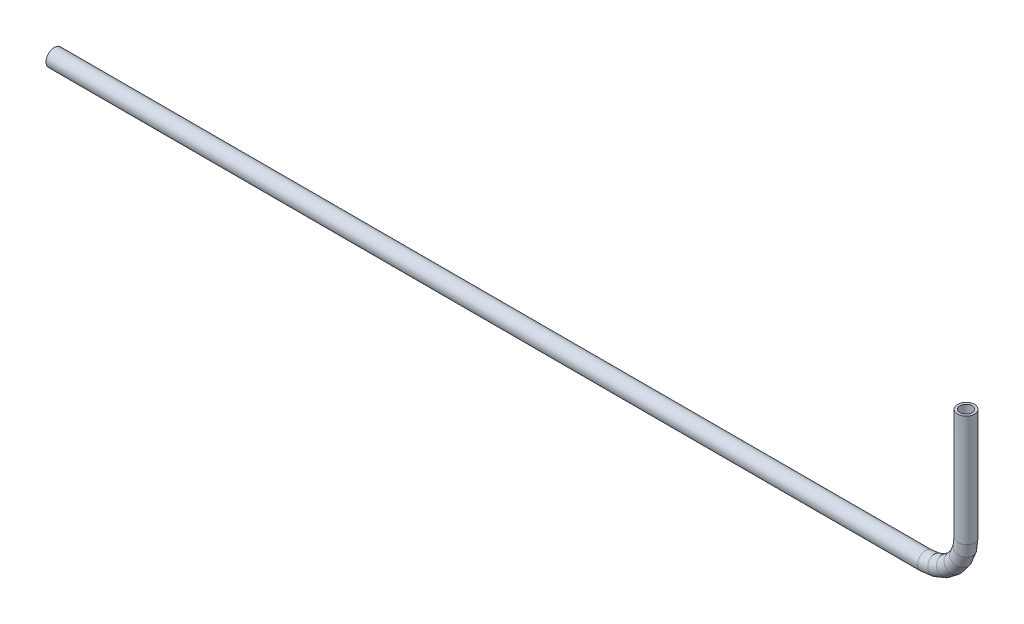
ISO-10303-21;
HEADER;
FILE_DESCRIPTION(('STEP AP214'),'2;1');
FILE_NAME('part.step','',(''),(''),'','','');
FILE_SCHEMA(('AUTOMOTIVE_DESIGN { 1 0 10303 214 1 1 1 1 }'));
ENDSEC;
DATA;
#1=APPLICATION_CONTEXT('core data for automotive mechanical design processes');
#2=APPLICATION_PROTOCOL_DEFINITION('international standard','automotive_design',2000,#1);
#3=PRODUCT_CONTEXT('',#1,'mechanical');
#4=PRODUCT('Part','Part','',(#3));
#5=PRODUCT_RELATED_PRODUCT_CATEGORY('part','',(#4));
#6=PRODUCT_DEFINITION_FORMATION('','',#4);
#7=PRODUCT_DEFINITION_CONTEXT('part definition',#1,'design');
#8=PRODUCT_DEFINITION('design','',#6,#7);
#9=PRODUCT_DEFINITION_SHAPE('','',#8);
#10=(LENGTH_UNIT() NAMED_UNIT(*) SI_UNIT(.MILLI.,.METRE.));
#11=(NAMED_UNIT(*) PLANE_ANGLE_UNIT() SI_UNIT($,.RADIAN.));
#12=(NAMED_UNIT(*) SI_UNIT($,.STERADIAN.) SOLID_ANGLE_UNIT());
#13=UNCERTAINTY_MEASURE_WITH_UNIT(LENGTH_MEASURE(1.E-05),#10,'distance_accuracy_value','');
#14=(GEOMETRIC_REPRESENTATION_CONTEXT(3) GLOBAL_UNCERTAINTY_ASSIGNED_CONTEXT((#13)) GLOBAL_UNIT_ASSIGNED_CONTEXT((#10,
#11,#12)) REPRESENTATION_CONTEXT('',''));
#15=CARTESIAN_POINT('',(0.,0.,0.));
#16=DIRECTION('',(0.,0.,1.));
#17=DIRECTION('',(1.,0.,0.));
#18=AXIS2_PLACEMENT_3D('',#15,#16,#17);
#19=CARTESIAN_POINT('',(-3008.59277838078,-73.557821087765,0.));
#20=DIRECTION('',(0.,1.,0.));
#21=DIRECTION('',(0.,0.,1.));
#22=AXIS2_PLACEMENT_3D('',#19,#20,#21);
#23=CYLINDRICAL_SURFACE('',#22,3.175);
#24=CARTESIAN_POINT('',(-3008.59277838078,-73.,0.));
#25=DIRECTION('',(0.0654031292301811,0.997858923238601,0.));
#26=DIRECTION('',(0.997858923238601,-0.0654031292301811,0.));
#27=AXIS2_PLACEMENT_3D('',#24,#25,#26);
#28=ELLIPSE('',#27,3.18181250481318,3.175);
#29=CARTESIAN_POINT('',(-3005.41777838077,-73.2081004944385,0.));
#30=VERTEX_POINT('',#29);
#31=EDGE_CURVE('E45',#30,#30,#28,.F.);
#32=ORIENTED_EDGE('',*,*,#31,.F.);
#33=EDGE_LOOP('',(#32));
#34=FACE_BOUND('',#33,.T.);
#35=CARTESIAN_POINT('',(-3008.59277838078,-31.2999999999977,0.));
#36=DIRECTION('',(0.,1.,0.));
#37=DIRECTION('',(0.,0.,-1.));
#38=AXIS2_PLACEMENT_3D('',#35,#36,#37);
#39=CIRCLE('',#38,3.175);
#40=CARTESIAN_POINT('',(-3008.59277838078,-31.2999999999977,-3.175));
#41=VERTEX_POINT('',#40);
#42=EDGE_CURVE('E80',#41,#41,#39,.T.);
#43=ORIENTED_EDGE('',*,*,#42,.F.);
#44=EDGE_LOOP('',(#43));
#45=FACE_BOUND('',#44,.T.);
#46=ADVANCED_FACE('F39',(#34,#45),#23,.T.);
#47=CARTESIAN_POINT('',(-3009.23697453862,-77.8931556153313,0.));
#48=DIRECTION('',(0.130526192220127,0.991444861373801,0.));
#49=DIRECTION('',(-0.991444861373801,0.130526192220127,0.));
#50=AXIS2_PLACEMENT_3D('',#47,#48,#49);
#51=CYLINDRICAL_SURFACE('',#50,3.175);
#52=CARTESIAN_POINT('',(-3009.10389098644,-76.8822856765375,0.));
#53=DIRECTION('',(0.258819045102505,0.965925826289073,0.));
#54=DIRECTION('',(0.965925826289073,-0.258819045102505,0.));
#55=AXIS2_PLACEMENT_3D('',#52,#53,#54);
#56=ELLIPSE('',#55,3.20239694984195,3.175);
#57=CARTESIAN_POINT('',(-3006.01061306656,-77.7111269971348,0.));
#58=VERTEX_POINT('',#57);
#59=EDGE_CURVE('E94',#58,#58,#56,.F.);
#60=ORIENTED_EDGE('',*,*,#59,.F.);
#61=EDGE_LOOP('',(#60));
#62=FACE_BOUND('',#61,.T.);
#63=ORIENTED_EDGE('',*,*,#31,.T.);
#64=EDGE_LOOP('',(#63));
#65=FACE_BOUND('',#64,.T.);
#66=ADVANCED_FACE('F101',(#62,#65),#51,.T.);
#67=CARTESIAN_POINT('',(-3010.99257855639,-81.4419808230071,0.));
#68=DIRECTION('',(0.382683432364989,0.923879532511329,0.));
#69=DIRECTION('',(-0.923879532511329,0.382683432364989,0.));
#70=AXIS2_PLACEMENT_3D('',#67,#68,#69);
#71=CYLINDRICAL_SURFACE('',#70,3.175);
#72=CARTESIAN_POINT('',(-3010.60239732401,-80.4999999999997,0.));
#73=DIRECTION('',(0.499999999999964,0.866025403784459,0.));
#74=DIRECTION('',(0.866025403784459,-0.499999999999964,0.));
#75=AXIS2_PLACEMENT_3D('',#72,#73,#74);
#76=ELLIPSE('',#75,3.20239694984201,3.175);
#77=CARTESIAN_POINT('',(-3007.82904021244,-82.1011984749206,0.));
#78=VERTEX_POINT('',#77);
#79=EDGE_CURVE('E95',#78,#78,#76,.F.);
#80=ORIENTED_EDGE('',*,*,#79,.F.);
#81=EDGE_LOOP('',(#80));
#82=FACE_BOUND('',#81,.T.);
#83=ORIENTED_EDGE('',*,*,#59,.T.);
#84=EDGE_LOOP('',(#83));
#85=FACE_BOUND('',#84,.T.);
#86=ADVANCED_FACE('F251',(#82,#85),#71,.T.);
#87=CARTESIAN_POINT('',(-3013.60686536939,-84.4154989886263,0.));
#88=DIRECTION('',(0.608761429008741,0.793353340291219,0.));
#89=DIRECTION('',(-0.793353340291219,0.608761429008742,0.));
#90=AXIS2_PLACEMENT_3D('',#87,#88,#89);
#91=CYLINDRICAL_SURFACE('',#90,3.175);
#92=CARTESIAN_POINT('',(-3012.98617666298,-83.6066017177978,0.));
#93=DIRECTION('',(0.70710678118655,0.707106781186545,0.));
#94=DIRECTION('',(0.707106781186545,-0.70710678118655,0.));
#95=AXIS2_PLACEMENT_3D('',#92,#93,#94);
#96=ELLIPSE('',#95,3.20239694984198,3.175);
#97=CARTESIAN_POINT('',(-3010.72174006369,-85.8710383170821,0.));
#98=VERTEX_POINT('',#97);
#99=EDGE_CURVE('E90',#98,#98,#96,.F.);
#100=ORIENTED_EDGE('',*,*,#99,.F.);
#101=EDGE_LOOP('',(#100));
#102=FACE_BOUND('',#101,.T.);
#103=ORIENTED_EDGE('',*,*,#79,.T.);
#104=EDGE_LOOP('',(#103));
#105=FACE_BOUND('',#104,.T.);
#106=ADVANCED_FACE('F241',(#102,#105),#91,.T.);
#107=CARTESIAN_POINT('',(-3016.9016756516,-86.6110697631757,0.));
#108=DIRECTION('',(0.793353340291223,0.608761429008737,0.));
#109=DIRECTION('',(-0.608761429008737,0.793353340291223,0.));
#110=AXIS2_PLACEMENT_3D('',#107,#108,#109);
#111=CYLINDRICAL_SURFACE('',#110,3.175);
#112=CARTESIAN_POINT('',(-3016.09277838077,-85.9903810567666,0.));
#113=DIRECTION('',(0.866025403784438,0.500000000000001,0.));
#114=DIRECTION('',(0.500000000000001,-0.866025403784438,0.));
#115=AXIS2_PLACEMENT_3D('',#112,#113,#114);
#116=ELLIPSE('',#115,3.20239694984199,3.175);
#117=CARTESIAN_POINT('',(-3014.49157990585,-88.7637381683316,0.));
#118=VERTEX_POINT('',#117);
#119=EDGE_CURVE('E88',#118,#118,#116,.F.);
#120=ORIENTED_EDGE('',*,*,#119,.F.);
#121=EDGE_LOOP('',(#120));
#122=FACE_BOUND('',#121,.T.);
#123=ORIENTED_EDGE('',*,*,#99,.T.);
#124=EDGE_LOOP('',(#123));
#125=FACE_BOUND('',#124,.T.);
#126=ADVANCED_FACE('F234',(#122,#125),#111,.T.);
#127=CARTESIAN_POINT('',(-3020.65247352724,-87.879068626721,0.));
#128=DIRECTION('',(0.923879532511294,0.382683432365073,0.));
#129=DIRECTION('',(-0.382683432365073,0.923879532511294,0.));
#130=AXIS2_PLACEMENT_3D('',#127,#128,#129);
#131=CYLINDRICAL_SURFACE('',#130,3.175);
#132=CARTESIAN_POINT('',(-3019.71049270424,-87.4888873943361,0.));
#133=DIRECTION('',(0.965925826289071,0.25881904510251,0.));
#134=DIRECTION('',(0.25881904510251,-0.965925826289071,0.));
#135=AXIS2_PLACEMENT_3D('',#132,#133,#134);
#136=ELLIPSE('',#135,3.20239694984198,3.175);
#137=CARTESIAN_POINT('',(-3018.88165138364,-90.5821653142178,0.));
#138=VERTEX_POINT('',#137);
#139=EDGE_CURVE('E82',#138,#138,#136,.F.);
#140=ORIENTED_EDGE('',*,*,#139,.F.);
#141=EDGE_LOOP('',(#140));
#142=FACE_BOUND('',#141,.T.);
#143=ORIENTED_EDGE('',*,*,#119,.T.);
#144=EDGE_LOOP('',(#143));
#145=FACE_BOUND('',#144,.T.);
#146=ADVANCED_FACE('F227',(#142,#145),#131,.T.);
#147=CARTESIAN_POINT('',(-3024.1458272318,-88.072810262526,0.));
#148=DIRECTION('',(0.991444861373811,0.130526192220047,0.));
#149=DIRECTION('',(-0.130526192220047,0.991444861373811,0.));
#150=AXIS2_PLACEMENT_3D('',#147,#148,#149);
#151=CYLINDRICAL_SURFACE('',#150,3.175);
#152=CARTESIAN_POINT('',(-3023.59277838077,-88.,0.));
#153=DIRECTION('',(0.997858923238604,0.0654031292301407,0.));
#154=DIRECTION('',(0.0654031292301407,-0.997858923238604,0.));
#155=AXIS2_PLACEMENT_3D('',#152,#153,#154);
#156=ELLIPSE('',#155,3.18181250481318,3.175);
#157=CARTESIAN_POINT('',(-3023.38467788634,-91.175,0.));
#158=VERTEX_POINT('',#157);
#159=EDGE_CURVE('E78',#158,#158,#156,.F.);
#160=ORIENTED_EDGE('',*,*,#159,.F.);
#161=EDGE_LOOP('',(#160));
#162=FACE_BOUND('',#161,.T.);
#163=ORIENTED_EDGE('',*,*,#139,.T.);
#164=EDGE_LOOP('',(#163));
#165=FACE_BOUND('',#164,.T.);
#166=ADVANCED_FACE('F118',(#162,#165),#151,.T.);
#167=CARTESIAN_POINT('',(-3351.14277838077,-88.,0.));
#168=DIRECTION('',(1.,0.,0.));
#169=DIRECTION('',(0.,0.,-1.));
#170=AXIS2_PLACEMENT_3D('',#167,#168,#169);
#171=CYLINDRICAL_SURFACE('',#170,3.175);
#172=CARTESIAN_POINT('',(-3351.14277838077,-88.,0.));
#173=DIRECTION('',(1.,0.,0.));
#174=DIRECTION('',(0.,0.,-1.));
#175=AXIS2_PLACEMENT_3D('',#172,#173,#174);
#176=CIRCLE('',#175,3.175);
#177=CARTESIAN_POINT('',(-3351.14277838077,-88.,-3.17499999999999));
#178=VERTEX_POINT('',#177);
#179=EDGE_CURVE('E74',#178,#178,#176,.T.);
#180=ORIENTED_EDGE('',*,*,#179,.T.);
#181=EDGE_LOOP('',(#180));
#182=FACE_BOUND('',#181,.T.);
#183=ORIENTED_EDGE('',*,*,#159,.T.);
#184=EDGE_LOOP('',(#183));
#185=FACE_BOUND('',#184,.T.);
#186=ADVANCED_FACE('F109',(#182,#185),#171,.T.);
#187=CARTESIAN_POINT('',(-3008.59277838078,-31.2999999999977,0.));
#188=DIRECTION('',(0.,1.,0.));
#189=DIRECTION('',(0.,0.,-1.));
#190=AXIS2_PLACEMENT_3D('',#187,#188,#189);
#191=PLANE('',#190);
#192=CARTESIAN_POINT('',(-3008.59277838078,-31.2999999999977,0.));
#193=DIRECTION('',(0.,1.,0.));
#194=DIRECTION('',(0.,0.,-1.));
#195=AXIS2_PLACEMENT_3D('',#192,#193,#194);
#196=CIRCLE('',#195,2.286);
#197=CARTESIAN_POINT('',(-3008.59277838078,-31.2999999999977,-2.286));
#198=VERTEX_POINT('',#197);
#199=EDGE_CURVE('E72',#198,#198,#196,.F.);
#200=ORIENTED_EDGE('',*,*,#199,.T.);
#201=EDGE_LOOP('',(#200));
#202=FACE_BOUND('',#201,.T.);
#203=ORIENTED_EDGE('',*,*,#42,.T.);
#204=EDGE_LOOP('',(#203));
#205=FACE_BOUND('',#204,.T.);
#206=ADVANCED_FACE('F110',(#202,#205),#191,.T.);
#207=CARTESIAN_POINT('',(-3351.14277838077,-88.,0.));
#208=DIRECTION('',(1.,0.,0.));
#209=DIRECTION('',(0.,0.,-1.));
#210=AXIS2_PLACEMENT_3D('',#207,#208,#209);
#211=PLANE('',#210);
#212=CARTESIAN_POINT('',(-3351.14277838077,-88.,0.));
#213=DIRECTION('',(1.,0.,0.));
#214=DIRECTION('',(0.,0.,-1.));
#215=AXIS2_PLACEMENT_3D('',#212,#213,#214);
#216=CIRCLE('',#215,2.286);
#217=CARTESIAN_POINT('',(-3351.14277838077,-88.,-2.28599999999999));
#218=VERTEX_POINT('',#217);
#219=EDGE_CURVE('E46',#218,#218,#216,.F.);
#220=ORIENTED_EDGE('',*,*,#219,.F.);
#221=EDGE_LOOP('',(#220));
#222=FACE_BOUND('',#221,.T.);
#223=ORIENTED_EDGE('',*,*,#179,.F.);
#224=EDGE_LOOP('',(#223));
#225=FACE_BOUND('',#224,.T.);
#226=ADVANCED_FACE('F108',(#222,#225),#211,.F.);
#227=CARTESIAN_POINT('',(-3008.59277838078,-73.4296311831906,0.));
#228=DIRECTION('',(0.,1.,0.));
#229=DIRECTION('',(0.,0.,1.));
#230=AXIS2_PLACEMENT_3D('',#227,#228,#229);
#231=CYLINDRICAL_SURFACE('',#230,2.286);
#232=CARTESIAN_POINT('',(-3008.59277838078,-73.,0.));
#233=DIRECTION('',(0.0654031292301811,0.997858923238601,0.));
#234=DIRECTION('',(0.997858923238601,-0.0654031292301811,0.));
#235=AXIS2_PLACEMENT_3D('',#232,#233,#234);
#236=ELLIPSE('',#235,2.29090500346549,2.286);
#237=CARTESIAN_POINT('',(-3006.30677838078,-73.1498323559957,0.));
#238=VERTEX_POINT('',#237);
#239=EDGE_CURVE('E67',#238,#238,#236,.T.);
#240=ORIENTED_EDGE('',*,*,#239,.F.);
#241=EDGE_LOOP('',(#240));
#242=FACE_BOUND('',#241,.T.);
#243=ORIENTED_EDGE('',*,*,#199,.F.);
#244=EDGE_LOOP('',(#243));
#245=FACE_BOUND('',#244,.T.);
#246=ADVANCED_FACE('F120',(#242,#245),#231,.F.);
#247=CARTESIAN_POINT('',(-3009.20336587739,-77.6378724885882,0.));
#248=DIRECTION('',(0.130526192220127,0.991444861373801,0.));
#249=DIRECTION('',(-0.991444861373801,0.130526192220127,0.));
#250=AXIS2_PLACEMENT_3D('',#247,#248,#249);
#251=CYLINDRICAL_SURFACE('',#250,2.286);
#252=CARTESIAN_POINT('',(-3009.10389098644,-76.8822856765376,0.));
#253=DIRECTION('',(0.258819045102505,0.965925826289073,0.));
#254=DIRECTION('',(0.965925826289073,-0.258819045102505,0.));
#255=AXIS2_PLACEMENT_3D('',#252,#253,#254);
#256=ELLIPSE('',#255,2.3057258038862,2.286);
#257=CARTESIAN_POINT('',(-3006.87673088412,-77.4790514273676,0.));
#258=VERTEX_POINT('',#257);
#259=EDGE_CURVE('E63',#258,#258,#256,.T.);
#260=ORIENTED_EDGE('',*,*,#259,.F.);
#261=EDGE_LOOP('',(#260));
#262=FACE_BOUND('',#261,.T.);
#263=ORIENTED_EDGE('',*,*,#239,.T.);
#264=EDGE_LOOP('',(#263));
#265=FACE_BOUND('',#264,.T.);
#266=ADVANCED_FACE('F149',(#262,#265),#251,.F.);
#267=CARTESIAN_POINT('',(-3010.89404294743,-81.2040948194754,0.));
#268=DIRECTION('',(0.382683432364989,0.923879532511329,0.));
#269=DIRECTION('',(-0.923879532511329,0.382683432364989,0.));
#270=AXIS2_PLACEMENT_3D('',#267,#268,#269);
#271=CYLINDRICAL_SURFACE('',#270,2.286);
#272=CARTESIAN_POINT('',(-3010.60239732401,-80.4999999999998,0.));
#273=DIRECTION('',(0.499999999999964,0.866025403784459,0.));
#274=DIRECTION('',(0.86602540378446,-0.499999999999964,0.));
#275=AXIS2_PLACEMENT_3D('',#272,#273,#274);
#276=ELLIPSE('',#275,2.30572580388625,2.286);
#277=CARTESIAN_POINT('',(-3008.60558020368,-81.6528629019429,0.));
#278=VERTEX_POINT('',#277);
#279=EDGE_CURVE('E65',#278,#278,#276,.T.);
#280=ORIENTED_EDGE('',*,*,#279,.F.);
#281=EDGE_LOOP('',(#280));
#282=FACE_BOUND('',#281,.T.);
#283=ORIENTED_EDGE('',*,*,#259,.T.);
#284=EDGE_LOOP('',(#283));
#285=FACE_BOUND('',#284,.T.);
#286=ADVANCED_FACE('F144',(#282,#285),#271,.F.);
#287=CARTESIAN_POINT('',(-3013.4501178516,-84.2112216463229,0.));
#288=DIRECTION('',(0.608761429008742,0.793353340291219,0.));
#289=DIRECTION('',(-0.793353340291219,0.608761429008742,0.));
#290=AXIS2_PLACEMENT_3D('',#287,#288,#289);
#291=CYLINDRICAL_SURFACE('',#290,2.286);
#292=CARTESIAN_POINT('',(-3012.98617666298,-83.6066017177978,0.));
#293=DIRECTION('',(0.70710678118655,0.707106781186546,0.));
#294=DIRECTION('',(0.707106781186546,-0.70710678118655,0.));
#295=AXIS2_PLACEMENT_3D('',#292,#293,#294);
#296=ELLIPSE('',#295,2.30572580388622,2.286);
#297=CARTESIAN_POINT('',(-3011.35578231149,-85.2369960692825,0.));
#298=VERTEX_POINT('',#297);
#299=EDGE_CURVE('E56',#298,#298,#296,.T.);
#300=ORIENTED_EDGE('',*,*,#299,.F.);
#301=EDGE_LOOP('',(#300));
#302=FACE_BOUND('',#301,.T.);
#303=ORIENTED_EDGE('',*,*,#279,.T.);
#304=EDGE_LOOP('',(#303));
#305=FACE_BOUND('',#304,.T.);
#306=ADVANCED_FACE('F143',(#302,#305),#291,.F.);
#307=CARTESIAN_POINT('',(-3016.6973983093,-86.4543222453933,0.));
#308=DIRECTION('',(0.793353340291223,0.608761429008737,0.));
#309=DIRECTION('',(-0.608761429008737,0.793353340291223,0.));
#310=AXIS2_PLACEMENT_3D('',#307,#308,#309);
#311=CYLINDRICAL_SURFACE('',#310,2.286);
#312=CARTESIAN_POINT('',(-3016.09277838077,-85.9903810567666,0.));
#313=DIRECTION('',(0.866025403784438,0.500000000000001,0.));
#314=DIRECTION('',(0.500000000000001,-0.866025403784438,0.));
#315=AXIS2_PLACEMENT_3D('',#312,#313,#314);
#316=ELLIPSE('',#315,2.30572580388623,2.286);
#317=CARTESIAN_POINT('',(-3014.93991547883,-87.9871981770934,0.));
#318=VERTEX_POINT('',#317);
#319=EDGE_CURVE('E57',#318,#318,#316,.T.);
#320=ORIENTED_EDGE('',*,*,#319,.F.);
#321=EDGE_LOOP('',(#320));
#322=FACE_BOUND('',#321,.T.);
#323=ORIENTED_EDGE('',*,*,#299,.T.);
#324=EDGE_LOOP('',(#323));
#325=FACE_BOUND('',#324,.T.);
#326=ADVANCED_FACE('F140',(#322,#325),#311,.F.);
#327=CARTESIAN_POINT('',(-3020.41458752371,-87.7805330177595,0.));
#328=DIRECTION('',(0.923879532511294,0.382683432365073,0.));
#329=DIRECTION('',(-0.382683432365073,0.923879532511294,0.));
#330=AXIS2_PLACEMENT_3D('',#327,#328,#329);
#331=CYLINDRICAL_SURFACE('',#330,2.286);
#332=CARTESIAN_POINT('',(-3019.71049270424,-87.4888873943361,0.));
#333=DIRECTION('',(0.965925826289071,0.25881904510251,0.));
#334=DIRECTION('',(0.25881904510251,-0.965925826289071,0.));
#335=AXIS2_PLACEMENT_3D('',#332,#333,#334);
#336=ELLIPSE('',#335,2.30572580388623,2.286);
#337=CARTESIAN_POINT('',(-3019.11372695341,-89.7160474966509,0.));
#338=VERTEX_POINT('',#337);
#339=EDGE_CURVE('E51',#338,#338,#336,.T.);
#340=ORIENTED_EDGE('',*,*,#339,.F.);
#341=EDGE_LOOP('',(#340));
#342=FACE_BOUND('',#341,.T.);
#343=ORIENTED_EDGE('',*,*,#319,.T.);
#344=EDGE_LOOP('',(#343));
#345=FACE_BOUND('',#344,.T.);
#346=ADVANCED_FACE('F132',(#342,#345),#331,.F.);
#347=CARTESIAN_POINT('',(-3024.01873400963,-88.0560781224009,0.));
#348=DIRECTION('',(0.991444861373811,0.130526192220047,0.));
#349=DIRECTION('',(-0.130526192220047,0.991444861373811,0.));
#350=AXIS2_PLACEMENT_3D('',#347,#348,#349);
#351=CYLINDRICAL_SURFACE('',#350,2.286);
#352=CARTESIAN_POINT('',(-3023.59277838077,-88.,0.));
#353=DIRECTION('',(0.997858923238604,0.0654031292301407,0.));
#354=DIRECTION('',(0.0654031292301407,-0.997858923238604,0.));
#355=AXIS2_PLACEMENT_3D('',#352,#353,#354);
#356=ELLIPSE('',#355,2.29090500346549,2.286);
#357=CARTESIAN_POINT('',(-3023.44294602478,-90.286,0.));
#358=VERTEX_POINT('',#357);
#359=EDGE_CURVE('E10',#358,#358,#356,.T.);
#360=ORIENTED_EDGE('',*,*,#359,.F.);
#361=EDGE_LOOP('',(#360));
#362=FACE_BOUND('',#361,.T.);
#363=ORIENTED_EDGE('',*,*,#339,.T.);
#364=EDGE_LOOP('',(#363));
#365=FACE_BOUND('',#364,.T.);
#366=ADVANCED_FACE('F124',(#362,#365),#351,.F.);
#367=CARTESIAN_POINT('',(-3351.14277838077,-88.,0.));
#368=DIRECTION('',(1.,0.,0.));
#369=DIRECTION('',(0.,0.,-1.));
#370=AXIS2_PLACEMENT_3D('',#367,#368,#369);
#371=CYLINDRICAL_SURFACE('',#370,2.286);
#372=ORIENTED_EDGE('',*,*,#219,.T.);
#373=EDGE_LOOP('',(#372));
#374=FACE_BOUND('',#373,.T.);
#375=ORIENTED_EDGE('',*,*,#359,.T.);
#376=EDGE_LOOP('',(#375));
#377=FACE_BOUND('',#376,.T.);
#378=ADVANCED_FACE('F122',(#374,#377),#371,.F.);
#379=CLOSED_SHELL('',(#46,#66,#86,#106,#126,#146,#166,#186,#206,#226,#246,#266,#286,#306,#326,
#346,#366,#378));
#380=MANIFOLD_SOLID_BREP('B2',#379);
#381=ADVANCED_BREP_SHAPE_REPRESENTATION('',(#18,#380),#14);
#382=SHAPE_DEFINITION_REPRESENTATION(#9,#381);
ENDSEC;
END-ISO-10303-21;
